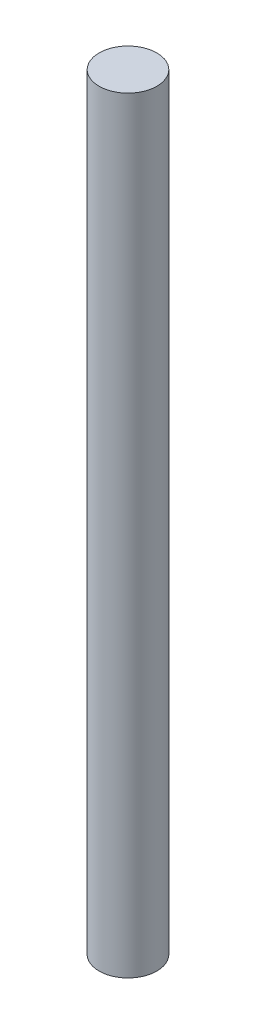
ISO-10303-21;
HEADER;
FILE_DESCRIPTION(('STEP AP214'),'2;1');
FILE_NAME('part.step','',(''),(''),'','','');
FILE_SCHEMA(('AUTOMOTIVE_DESIGN { 1 0 10303 214 1 1 1 1 }'));
ENDSEC;
DATA;
#1=APPLICATION_CONTEXT('core data for automotive mechanical design processes');
#2=APPLICATION_PROTOCOL_DEFINITION('international standard','automotive_design',2000,#1);
#3=PRODUCT_CONTEXT('',#1,'mechanical');
#4=PRODUCT('Part','Part','',(#3));
#5=PRODUCT_RELATED_PRODUCT_CATEGORY('part','',(#4));
#6=PRODUCT_DEFINITION_FORMATION('','',#4);
#7=PRODUCT_DEFINITION_CONTEXT('part definition',#1,'design');
#8=PRODUCT_DEFINITION('design','',#6,#7);
#9=PRODUCT_DEFINITION_SHAPE('','',#8);
#10=(LENGTH_UNIT() NAMED_UNIT(*) SI_UNIT(.MILLI.,.METRE.));
#11=(NAMED_UNIT(*) PLANE_ANGLE_UNIT() SI_UNIT($,.RADIAN.));
#12=(NAMED_UNIT(*) SI_UNIT($,.STERADIAN.) SOLID_ANGLE_UNIT());
#13=UNCERTAINTY_MEASURE_WITH_UNIT(LENGTH_MEASURE(1.E-05),#10,'distance_accuracy_value','');
#14=(GEOMETRIC_REPRESENTATION_CONTEXT(3) GLOBAL_UNCERTAINTY_ASSIGNED_CONTEXT((#13)) GLOBAL_UNIT_ASSIGNED_CONTEXT((#10,
#11,#12)) REPRESENTATION_CONTEXT('',''));
#15=CARTESIAN_POINT('',(0.,0.,0.));
#16=DIRECTION('',(0.,0.,1.));
#17=DIRECTION('',(1.,0.,0.));
#18=AXIS2_PLACEMENT_3D('',#15,#16,#17);
#19=CARTESIAN_POINT('',(0.,21.0312,0.));
#20=DIRECTION('',(0.,-1.,0.));
#21=DIRECTION('',(0.,0.,-1.));
#22=AXIS2_PLACEMENT_3D('',#19,#20,#21);
#23=CYLINDRICAL_SURFACE('',#22,0.792479999999998);
#24=CARTESIAN_POINT('',(0.,21.0312,0.));
#25=DIRECTION('',(0.,1.,0.));
#26=DIRECTION('',(0.,0.,1.));
#27=AXIS2_PLACEMENT_3D('',#24,#25,#26);
#28=CIRCLE('',#27,0.792479999999998);
#29=CARTESIAN_POINT('',(0.,21.0312,0.792479999999998));
#30=VERTEX_POINT('',#29);
#31=EDGE_CURVE('E10',#30,#30,#28,.T.);
#32=ORIENTED_EDGE('',*,*,#31,.F.);
#33=EDGE_LOOP('',(#32));
#34=FACE_BOUND('',#33,.T.);
#35=CARTESIAN_POINT('',(0.,0.,0.));
#36=DIRECTION('',(0.,1.,0.));
#37=DIRECTION('',(0.,0.,1.));
#38=AXIS2_PLACEMENT_3D('',#35,#36,#37);
#39=CIRCLE('',#38,0.792479999999998);
#40=CARTESIAN_POINT('',(0.,0.,0.792479999999998));
#41=VERTEX_POINT('',#40);
#42=EDGE_CURVE('E40',#41,#41,#39,.T.);
#43=ORIENTED_EDGE('',*,*,#42,.T.);
#44=EDGE_LOOP('',(#43));
#45=FACE_BOUND('',#44,.T.);
#46=ADVANCED_FACE('F37',(#34,#45),#23,.T.);
#47=CARTESIAN_POINT('',(0.,21.0312,0.));
#48=DIRECTION('',(0.,1.,0.));
#49=DIRECTION('',(0.,0.,1.));
#50=AXIS2_PLACEMENT_3D('',#47,#48,#49);
#51=PLANE('',#50);
#52=ORIENTED_EDGE('',*,*,#31,.T.);
#53=EDGE_LOOP('',(#52));
#54=FACE_BOUND('',#53,.T.);
#55=ADVANCED_FACE('F52',(#54),#51,.T.);
#56=CARTESIAN_POINT('',(0.,0.,0.));
#57=DIRECTION('',(0.,1.,0.));
#58=DIRECTION('',(0.,0.,1.));
#59=AXIS2_PLACEMENT_3D('',#56,#57,#58);
#60=PLANE('',#59);
#61=ORIENTED_EDGE('',*,*,#42,.F.);
#62=EDGE_LOOP('',(#61));
#63=FACE_BOUND('',#62,.T.);
#64=ADVANCED_FACE('F50',(#63),#60,.F.);
#65=CLOSED_SHELL('',(#46,#55,#64));
#66=MANIFOLD_SOLID_BREP('B2',#65);
#67=ADVANCED_BREP_SHAPE_REPRESENTATION('',(#18,#66),#14);
#68=SHAPE_DEFINITION_REPRESENTATION(#9,#67);
ENDSEC;
END-ISO-10303-21;
